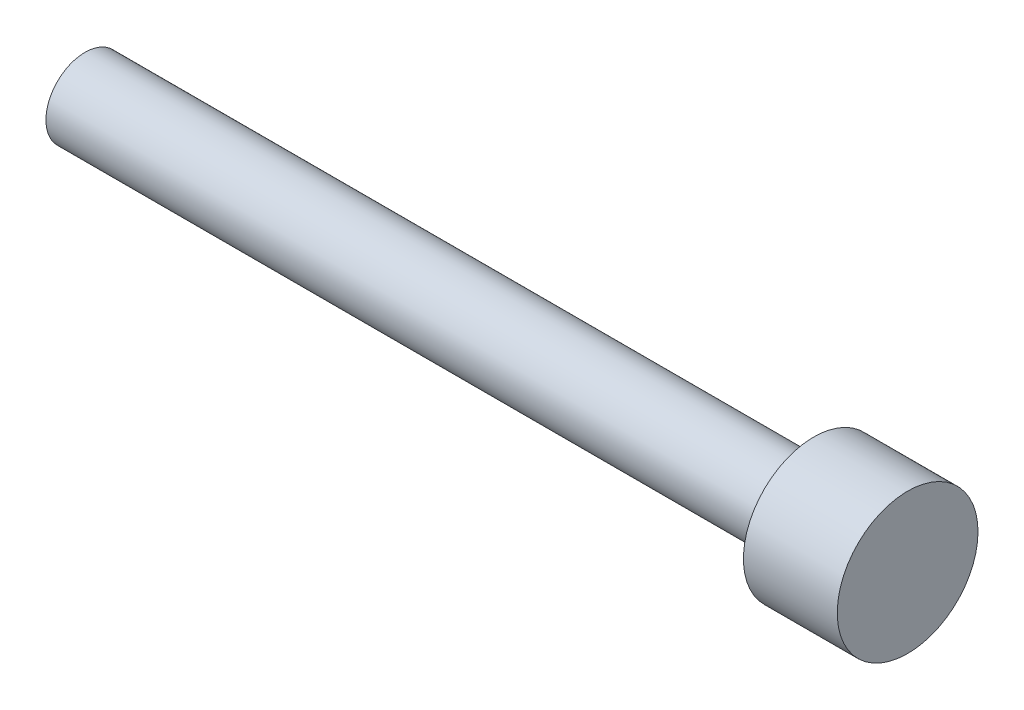
ISO-10303-21;
HEADER;
FILE_DESCRIPTION(('STEP AP214'),'2;1');
FILE_NAME('part.step','',(''),(''),'','','');
FILE_SCHEMA(('AUTOMOTIVE_DESIGN { 1 0 10303 214 1 1 1 1 }'));
ENDSEC;
DATA;
#1=APPLICATION_CONTEXT('core data for automotive mechanical design processes');
#2=APPLICATION_PROTOCOL_DEFINITION('international standard','automotive_design',2000,#1);
#3=PRODUCT_CONTEXT('',#1,'mechanical');
#4=PRODUCT('Part','Part','',(#3));
#5=PRODUCT_RELATED_PRODUCT_CATEGORY('part','',(#4));
#6=PRODUCT_DEFINITION_FORMATION('','',#4);
#7=PRODUCT_DEFINITION_CONTEXT('part definition',#1,'design');
#8=PRODUCT_DEFINITION('design','',#6,#7);
#9=PRODUCT_DEFINITION_SHAPE('','',#8);
#10=(LENGTH_UNIT() NAMED_UNIT(*) SI_UNIT(.MILLI.,.METRE.));
#11=(NAMED_UNIT(*) PLANE_ANGLE_UNIT() SI_UNIT($,.RADIAN.));
#12=(NAMED_UNIT(*) SI_UNIT($,.STERADIAN.) SOLID_ANGLE_UNIT());
#13=UNCERTAINTY_MEASURE_WITH_UNIT(LENGTH_MEASURE(1.E-05),#10,'distance_accuracy_value','');
#14=(GEOMETRIC_REPRESENTATION_CONTEXT(3) GLOBAL_UNCERTAINTY_ASSIGNED_CONTEXT((#13)) GLOBAL_UNIT_ASSIGNED_CONTEXT((#10,
#11,#12)) REPRESENTATION_CONTEXT('',''));
#15=CARTESIAN_POINT('',(0.,0.,0.));
#16=DIRECTION('',(0.,0.,1.));
#17=DIRECTION('',(1.,0.,0.));
#18=AXIS2_PLACEMENT_3D('',#15,#16,#17);
#19=CARTESIAN_POINT('',(11.65,0.,0.));
#20=DIRECTION('',(-1.,0.,0.));
#21=DIRECTION('',(0.,0.,1.));
#22=AXIS2_PLACEMENT_3D('',#19,#20,#21);
#23=CYLINDRICAL_SURFACE('',#22,1.25);
#24=CARTESIAN_POINT('',(11.65,0.,0.));
#25=DIRECTION('',(1.,0.,0.));
#26=DIRECTION('',(0.,0.,-1.));
#27=AXIS2_PLACEMENT_3D('',#24,#25,#26);
#28=CIRCLE('',#27,1.25);
#29=CARTESIAN_POINT('',(11.65,0.,-1.25));
#30=VERTEX_POINT('',#29);
#31=EDGE_CURVE('E10',#30,#30,#28,.T.);
#32=ORIENTED_EDGE('',*,*,#31,.F.);
#33=EDGE_LOOP('',(#32));
#34=FACE_BOUND('',#33,.T.);
#35=CARTESIAN_POINT('',(-11.65,0.,0.));
#36=DIRECTION('',(1.,0.,0.));
#37=DIRECTION('',(0.,0.,-1.));
#38=AXIS2_PLACEMENT_3D('',#35,#36,#37);
#39=CIRCLE('',#38,1.25);
#40=CARTESIAN_POINT('',(-11.65,0.,-1.25));
#41=VERTEX_POINT('',#40);
#42=EDGE_CURVE('E34',#41,#41,#39,.T.);
#43=ORIENTED_EDGE('',*,*,#42,.T.);
#44=EDGE_LOOP('',(#43));
#45=FACE_BOUND('',#44,.T.);
#46=ADVANCED_FACE('F31',(#34,#45),#23,.T.);
#47=CARTESIAN_POINT('',(-11.65,0.,0.));
#48=DIRECTION('',(1.,0.,0.));
#49=DIRECTION('',(0.,0.,-1.));
#50=AXIS2_PLACEMENT_3D('',#47,#48,#49);
#51=PLANE('',#50);
#52=ORIENTED_EDGE('',*,*,#42,.F.);
#53=EDGE_LOOP('',(#52));
#54=FACE_BOUND('',#53,.T.);
#55=ADVANCED_FACE('F54',(#54),#51,.F.);
#56=CARTESIAN_POINT('',(14.65,0.,0.));
#57=DIRECTION('',(-1.,0.,0.));
#58=DIRECTION('',(0.,0.,1.));
#59=AXIS2_PLACEMENT_3D('',#56,#57,#58);
#60=CYLINDRICAL_SURFACE('',#59,2.25);
#61=CARTESIAN_POINT('',(14.65,0.,0.));
#62=DIRECTION('',(1.,0.,0.));
#63=DIRECTION('',(0.,0.,-1.));
#64=AXIS2_PLACEMENT_3D('',#61,#62,#63);
#65=CIRCLE('',#64,2.25);
#66=CARTESIAN_POINT('',(14.65,0.,-2.25));
#67=VERTEX_POINT('',#66);
#68=EDGE_CURVE('E41',#67,#67,#65,.T.);
#69=ORIENTED_EDGE('',*,*,#68,.F.);
#70=EDGE_LOOP('',(#69));
#71=FACE_BOUND('',#70,.T.);
#72=CARTESIAN_POINT('',(11.65,0.,0.));
#73=DIRECTION('',(1.,0.,0.));
#74=DIRECTION('',(0.,0.,-1.));
#75=AXIS2_PLACEMENT_3D('',#72,#73,#74);
#76=CIRCLE('',#75,2.25);
#77=CARTESIAN_POINT('',(11.65,0.,-2.25));
#78=VERTEX_POINT('',#77);
#79=EDGE_CURVE('E43',#78,#78,#76,.T.);
#80=ORIENTED_EDGE('',*,*,#79,.T.);
#81=EDGE_LOOP('',(#80));
#82=FACE_BOUND('',#81,.T.);
#83=ADVANCED_FACE('F51',(#71,#82),#60,.T.);
#84=CARTESIAN_POINT('',(14.65,0.,0.));
#85=DIRECTION('',(1.,0.,0.));
#86=DIRECTION('',(0.,0.,-1.));
#87=AXIS2_PLACEMENT_3D('',#84,#85,#86);
#88=PLANE('',#87);
#89=ORIENTED_EDGE('',*,*,#68,.T.);
#90=EDGE_LOOP('',(#89));
#91=FACE_BOUND('',#90,.T.);
#92=ADVANCED_FACE('F49',(#91),#88,.T.);
#93=CARTESIAN_POINT('',(11.65,0.,0.));
#94=DIRECTION('',(1.,0.,0.));
#95=DIRECTION('',(0.,0.,-1.));
#96=AXIS2_PLACEMENT_3D('',#93,#94,#95);
#97=PLANE('',#96);
#98=ORIENTED_EDGE('',*,*,#31,.T.);
#99=EDGE_LOOP('',(#98));
#100=FACE_BOUND('',#99,.T.);
#101=ORIENTED_EDGE('',*,*,#79,.F.);
#102=EDGE_LOOP('',(#101));
#103=FACE_BOUND('',#102,.T.);
#104=ADVANCED_FACE('F58',(#100,#103),#97,.F.);
#105=CLOSED_SHELL('',(#46,#55,#83,#92,#104));
#106=MANIFOLD_SOLID_BREP('B2',#105);
#107=ADVANCED_BREP_SHAPE_REPRESENTATION('',(#18,#106),#14);
#108=SHAPE_DEFINITION_REPRESENTATION(#9,#107);
ENDSEC;
END-ISO-10303-21;
